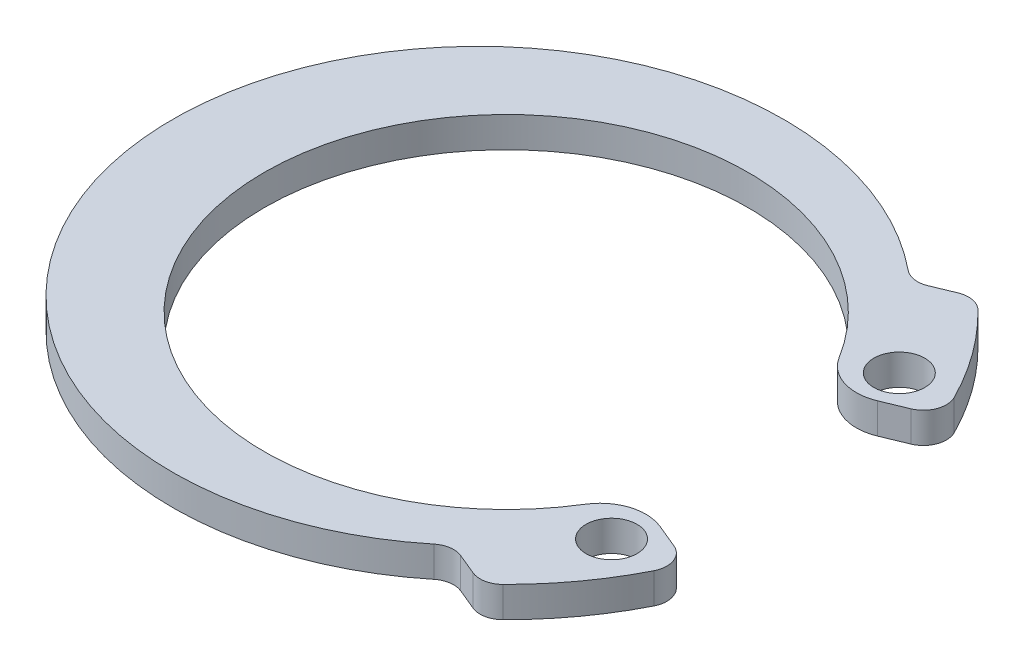
ISO-10303-21;
HEADER;
FILE_DESCRIPTION(('STEP AP214'),'2;1');
FILE_NAME('part.step','',(''),(''),'','','');
FILE_SCHEMA(('AUTOMOTIVE_DESIGN { 1 0 10303 214 1 1 1 1 }'));
ENDSEC;
DATA;
#1=APPLICATION_CONTEXT('core data for automotive mechanical design processes');
#2=APPLICATION_PROTOCOL_DEFINITION('international standard','automotive_design',2000,#1);
#3=PRODUCT_CONTEXT('',#1,'mechanical');
#4=PRODUCT('Part','Part','',(#3));
#5=PRODUCT_RELATED_PRODUCT_CATEGORY('part','',(#4));
#6=PRODUCT_DEFINITION_FORMATION('','',#4);
#7=PRODUCT_DEFINITION_CONTEXT('part definition',#1,'design');
#8=PRODUCT_DEFINITION('design','',#6,#7);
#9=PRODUCT_DEFINITION_SHAPE('','',#8);
#10=(LENGTH_UNIT() NAMED_UNIT(*) SI_UNIT(.MILLI.,.METRE.));
#11=(NAMED_UNIT(*) PLANE_ANGLE_UNIT() SI_UNIT($,.RADIAN.));
#12=(NAMED_UNIT(*) SI_UNIT($,.STERADIAN.) SOLID_ANGLE_UNIT());
#13=UNCERTAINTY_MEASURE_WITH_UNIT(LENGTH_MEASURE(1.E-05),#10,'distance_accuracy_value','');
#14=(GEOMETRIC_REPRESENTATION_CONTEXT(3) GLOBAL_UNCERTAINTY_ASSIGNED_CONTEXT((#13)) GLOBAL_UNIT_ASSIGNED_CONTEXT((#10,
#11,#12)) REPRESENTATION_CONTEXT('',''));
#15=CARTESIAN_POINT('',(0.,0.,0.));
#16=DIRECTION('',(0.,0.,1.));
#17=DIRECTION('',(1.,0.,0.));
#18=AXIS2_PLACEMENT_3D('',#15,#16,#17);
#19=CARTESIAN_POINT('',(4.28209468372585,0.3,4.34438316905942));
#20=DIRECTION('',(0.,1.,0.));
#21=DIRECTION('',(0.,0.,1.));
#22=AXIS2_PLACEMENT_3D('',#19,#20,#21);
#23=PLANE('',#22);
#24=CARTESIAN_POINT('',(4.89304353138207,0.3,2.82500000000001));
#25=DIRECTION('',(0.,1.,0.));
#26=DIRECTION('',(0.,0.,1.));
#27=AXIS2_PLACEMENT_3D('',#24,#25,#26);
#28=CIRCLE('',#27,0.5);
#29=CARTESIAN_POINT('',(4.89304353138207,0.3,3.32500000000001));
#30=VERTEX_POINT('',#29);
#31=EDGE_CURVE('E222',#30,#30,#28,.T.);
#32=ORIENTED_EDGE('',*,*,#31,.F.);
#33=EDGE_LOOP('',(#32));
#34=FACE_BOUND('',#33,.T.);
#35=CARTESIAN_POINT('',(4.28209468372585,0.3,4.34438316905942));
#36=DIRECTION('',(0.,1.,0.));
#37=DIRECTION('',(0.,0.,1.));
#38=AXIS2_PLACEMENT_3D('',#35,#36,#37);
#39=CIRCLE('',#38,0.45);
#40=CARTESIAN_POINT('',(4.10988713916156,0.3,4.7601289586895));
#41=VERTEX_POINT('',#40);
#42=CARTESIAN_POINT('',(4.59798691449251,0.3,4.66487045202282));
#43=VERTEX_POINT('',#42);
#44=EDGE_CURVE('E225',#41,#43,#39,.T.);
#45=ORIENTED_EDGE('',*,*,#44,.T.);
#46=CARTESIAN_POINT('',(0.,0.3,0.));
#47=DIRECTION('',(0.,1.,0.));
#48=DIRECTION('',(0.,0.,1.));
#49=AXIS2_PLACEMENT_3D('',#46,#47,#48);
#50=CIRCLE('',#49,6.55);
#51=CARTESIAN_POINT('',(5.85001094667601,0.3,2.94616223649868));
#52=VERTEX_POINT('',#51);
#53=EDGE_CURVE('E157',#43,#52,#50,.T.);
#54=ORIENTED_EDGE('',*,*,#53,.T.);
#55=CARTESIAN_POINT('',(5.44810179766773,0.3,2.7437541439148));
#56=DIRECTION('',(0.,1.,0.));
#57=DIRECTION('',(0.,0.,-1.));
#58=AXIS2_PLACEMENT_3D('',#55,#56,#57);
#59=CIRCLE('',#58,0.45);
#60=CARTESIAN_POINT('',(5.62030934223202,0.3,2.32800835428472));
#61=VERTEX_POINT('',#60);
#62=EDGE_CURVE('E228',#52,#61,#59,.T.);
#63=ORIENTED_EDGE('',*,*,#62,.T.);
#64=DIRECTION('',(-0.923879532511286,0.,-0.382683432365091));
#65=VECTOR('',#64,1.);
#66=CARTESIAN_POINT('',(5.15326885237256,0.3,2.13455384920756));
#67=LINE('',#66,#65);
#68=CARTESIAN_POINT('',(5.15326885237256,0.3,2.13455384920756));
#69=VERTEX_POINT('',#68);
#70=EDGE_CURVE('E230',#61,#69,#67,.T.);
#71=ORIENTED_EDGE('',*,*,#70,.T.);
#72=CARTESIAN_POINT('',(4.80885376324398,0.3,2.96604542846771));
#73=DIRECTION('',(0.,1.,0.));
#74=DIRECTION('',(0.,0.,1.));
#75=AXIS2_PLACEMENT_3D('',#72,#73,#74);
#76=CIRCLE('',#75,0.9);
#77=CARTESIAN_POINT('',(4.04284165936441,0.3,2.49357801508347));
#78=VERTEX_POINT('',#77);
#79=EDGE_CURVE('E232',#69,#78,#76,.T.);
#80=ORIENTED_EDGE('',*,*,#79,.T.);
#81=CARTESIAN_POINT('',(0.,0.3,0.));
#82=DIRECTION('',(0.,-1.,0.));
#83=DIRECTION('',(0.,0.,1.));
#84=AXIS2_PLACEMENT_3D('',#81,#82,#83);
#85=CIRCLE('',#84,4.75);
#86=CARTESIAN_POINT('',(4.04284165936441,0.3,-2.49357801508348));
#87=VERTEX_POINT('',#86);
#88=EDGE_CURVE('E234',#78,#87,#85,.T.);
#89=ORIENTED_EDGE('',*,*,#88,.T.);
#90=CARTESIAN_POINT('',(4.80885376324398,0.3,-2.96604542846771));
#91=DIRECTION('',(0.,1.,0.));
#92=DIRECTION('',(0.,0.,-1.));
#93=AXIS2_PLACEMENT_3D('',#90,#91,#92);
#94=CIRCLE('',#93,0.899999999999999);
#95=CARTESIAN_POINT('',(5.15326885237256,0.3,-2.13455384920756));
#96=VERTEX_POINT('',#95);
#97=EDGE_CURVE('E236',#87,#96,#94,.T.);
#98=ORIENTED_EDGE('',*,*,#97,.T.);
#99=DIRECTION('',(0.923879532511287,0.,-0.38268343236509));
#100=VECTOR('',#99,1.);
#101=CARTESIAN_POINT('',(5.15326885237256,0.3,-2.13455384920756));
#102=LINE('',#101,#100);
#103=CARTESIAN_POINT('',(5.62030934223202,0.3,-2.32800835428472));
#104=VERTEX_POINT('',#103);
#105=EDGE_CURVE('E238',#96,#104,#102,.T.);
#106=ORIENTED_EDGE('',*,*,#105,.T.);
#107=CARTESIAN_POINT('',(5.44810179766773,0.3,-2.7437541439148));
#108=DIRECTION('',(0.,1.,0.));
#109=DIRECTION('',(0.,0.,1.));
#110=AXIS2_PLACEMENT_3D('',#107,#108,#109);
#111=CIRCLE('',#110,0.45);
#112=CARTESIAN_POINT('',(5.85001094667601,0.3,-2.94616223649868));
#113=VERTEX_POINT('',#112);
#114=EDGE_CURVE('E240',#104,#113,#111,.T.);
#115=ORIENTED_EDGE('',*,*,#114,.T.);
#116=CARTESIAN_POINT('',(0.,0.3,0.));
#117=DIRECTION('',(0.,1.,0.));
#118=DIRECTION('',(0.,0.,-1.));
#119=AXIS2_PLACEMENT_3D('',#116,#117,#118);
#120=CIRCLE('',#119,6.55);
#121=CARTESIAN_POINT('',(4.59798691449251,0.3,-4.66487045202282));
#122=VERTEX_POINT('',#121);
#123=EDGE_CURVE('E242',#113,#122,#120,.T.);
#124=ORIENTED_EDGE('',*,*,#123,.T.);
#125=CARTESIAN_POINT('',(4.28209468372585,0.3,-4.34438316905942));
#126=DIRECTION('',(0.,1.,0.));
#127=DIRECTION('',(0.,0.,-1.));
#128=AXIS2_PLACEMENT_3D('',#125,#126,#127);
#129=CIRCLE('',#128,0.449999999999999);
#130=CARTESIAN_POINT('',(4.10988713916156,0.3,-4.7601289586895));
#131=VERTEX_POINT('',#130);
#132=EDGE_CURVE('E244',#122,#131,#129,.T.);
#133=ORIENTED_EDGE('',*,*,#132,.T.);
#134=DIRECTION('',(-0.923879532511287,0.,0.38268343236509));
#135=VECTOR('',#134,1.);
#136=CARTESIAN_POINT('',(3.69365894425914,0.3,-4.58772159531885));
#137=LINE('',#136,#135);
#138=CARTESIAN_POINT('',(3.69365894425914,0.3,-4.58772159531885));
#139=VERTEX_POINT('',#138);
#140=EDGE_CURVE('E246',#131,#139,#137,.T.);
#141=ORIENTED_EDGE('',*,*,#140,.T.);
#142=CARTESIAN_POINT('',(3.52145139969485,0.3,-5.00346738494892));
#143=DIRECTION('',(0.,-1.,0.));
#144=DIRECTION('',(0.,0.,1.));
#145=AXIS2_PLACEMENT_3D('',#142,#143,#144);
#146=CIRCLE('',#145,0.45);
#147=CARTESIAN_POINT('',(3.23744479467802,0.3,-4.65441115981203));
#148=VERTEX_POINT('',#147);
#149=EDGE_CURVE('E248',#139,#148,#146,.T.);
#150=ORIENTED_EDGE('',*,*,#149,.T.);
#151=CARTESIAN_POINT('',(-0.549576941812182,0.3,0.));
#152=DIRECTION('',(0.,1.,0.));
#153=DIRECTION('',(0.,0.,1.));
#154=AXIS2_PLACEMENT_3D('',#151,#152,#153);
#155=CIRCLE('',#154,6.00042305818782);
#156=CARTESIAN_POINT('',(3.23744479467802,0.3,4.65441115981203));
#157=VERTEX_POINT('',#156);
#158=EDGE_CURVE('E250',#148,#157,#155,.T.);
#159=ORIENTED_EDGE('',*,*,#158,.T.);
#160=CARTESIAN_POINT('',(3.52145139969485,0.3,5.00346738494892));
#161=DIRECTION('',(0.,-1.,0.));
#162=DIRECTION('',(0.,0.,-1.));
#163=AXIS2_PLACEMENT_3D('',#160,#161,#162);
#164=CIRCLE('',#163,0.450000000000001);
#165=CARTESIAN_POINT('',(3.69365894425914,0.3,4.58772159531884));
#166=VERTEX_POINT('',#165);
#167=EDGE_CURVE('E61',#157,#166,#164,.T.);
#168=ORIENTED_EDGE('',*,*,#167,.T.);
#169=DIRECTION('',(0.923879532511286,0.,0.382683432365092));
#170=VECTOR('',#169,1.);
#171=CARTESIAN_POINT('',(3.69365894425914,0.3,4.58772159531884));
#172=LINE('',#171,#170);
#173=EDGE_CURVE('E56',#166,#41,#172,.T.);
#174=ORIENTED_EDGE('',*,*,#173,.T.);
#175=EDGE_LOOP('',(#45,#54,#63,#71,#80,#89,#98,#106,#115,#124,#133,#141,#150,#159,#168,#174));
#176=FACE_BOUND('',#175,.T.);
#177=CARTESIAN_POINT('',(4.89304353138207,0.3,-2.82500000000001));
#178=DIRECTION('',(0.,1.,0.));
#179=DIRECTION('',(0.,0.,1.));
#180=AXIS2_PLACEMENT_3D('',#177,#178,#179);
#181=CIRCLE('',#180,0.5);
#182=CARTESIAN_POINT('',(4.89304353138207,0.3,-2.32500000000001));
#183=VERTEX_POINT('',#182);
#184=EDGE_CURVE('E219',#183,#183,#181,.T.);
#185=ORIENTED_EDGE('',*,*,#184,.F.);
#186=EDGE_LOOP('',(#185));
#187=FACE_BOUND('',#186,.T.);
#188=ADVANCED_FACE('F41',(#34,#176,#187),#23,.T.);
#189=CARTESIAN_POINT('',(4.28209468372585,0.3,4.34438316905942));
#190=DIRECTION('',(0.,-1.,0.));
#191=DIRECTION('',(0.,0.,-1.));
#192=AXIS2_PLACEMENT_3D('',#189,#190,#191);
#193=CYLINDRICAL_SURFACE('',#192,0.45);
#194=DIRECTION('',(0.,-1.,0.));
#195=VECTOR('',#194,1.);
#196=CARTESIAN_POINT('',(4.10988713916156,0.3,4.7601289586895));
#197=LINE('',#196,#195);
#198=CARTESIAN_POINT('',(4.10988713916156,-0.3,4.7601289586895));
#199=VERTEX_POINT('',#198);
#200=EDGE_CURVE('E172',#41,#199,#197,.T.);
#201=ORIENTED_EDGE('',*,*,#200,.T.);
#202=CARTESIAN_POINT('',(4.28209468372585,-0.3,4.34438316905942));
#203=DIRECTION('',(0.,1.,0.));
#204=DIRECTION('',(0.,0.,1.));
#205=AXIS2_PLACEMENT_3D('',#202,#203,#204);
#206=CIRCLE('',#205,0.45);
#207=CARTESIAN_POINT('',(4.59798691449251,-0.3,4.66487045202282));
#208=VERTEX_POINT('',#207);
#209=EDGE_CURVE('E166',#199,#208,#206,.T.);
#210=ORIENTED_EDGE('',*,*,#209,.T.);
#211=DIRECTION('',(0.,-1.,0.));
#212=VECTOR('',#211,1.);
#213=CARTESIAN_POINT('',(4.59798691449251,0.3,4.66487045202282));
#214=LINE('',#213,#212);
#215=EDGE_CURVE('E11',#43,#208,#214,.T.);
#216=ORIENTED_EDGE('',*,*,#215,.F.);
#217=ORIENTED_EDGE('',*,*,#44,.F.);
#218=EDGE_LOOP('',(#201,#210,#216,#217));
#219=FACE_BOUND('',#218,.T.);
#220=ADVANCED_FACE('F43',(#219),#193,.T.);
#221=CARTESIAN_POINT('',(0.,0.3,0.));
#222=DIRECTION('',(0.,-1.,0.));
#223=DIRECTION('',(0.,0.,-1.));
#224=AXIS2_PLACEMENT_3D('',#221,#222,#223);
#225=CYLINDRICAL_SURFACE('',#224,6.55);
#226=ORIENTED_EDGE('',*,*,#215,.T.);
#227=CARTESIAN_POINT('',(0.,-0.3,0.));
#228=DIRECTION('',(0.,1.,0.));
#229=DIRECTION('',(0.,0.,1.));
#230=AXIS2_PLACEMENT_3D('',#227,#228,#229);
#231=CIRCLE('',#230,6.55);
#232=CARTESIAN_POINT('',(5.85001094667601,-0.3,2.94616223649868));
#233=VERTEX_POINT('',#232);
#234=EDGE_CURVE('E156',#208,#233,#231,.T.);
#235=ORIENTED_EDGE('',*,*,#234,.T.);
#236=DIRECTION('',(0.,-1.,0.));
#237=VECTOR('',#236,1.);
#238=CARTESIAN_POINT('',(5.85001094667601,0.3,2.94616223649868));
#239=LINE('',#238,#237);
#240=EDGE_CURVE('E49',#52,#233,#239,.T.);
#241=ORIENTED_EDGE('',*,*,#240,.F.);
#242=ORIENTED_EDGE('',*,*,#53,.F.);
#243=EDGE_LOOP('',(#226,#235,#241,#242));
#244=FACE_BOUND('',#243,.T.);
#245=ADVANCED_FACE('F154',(#244),#225,.T.);
#246=CARTESIAN_POINT('',(5.44810179766773,0.3,2.7437541439148));
#247=DIRECTION('',(0.,-1.,0.));
#248=DIRECTION('',(0.,0.,-1.));
#249=AXIS2_PLACEMENT_3D('',#246,#247,#248);
#250=CYLINDRICAL_SURFACE('',#249,0.45);
#251=ORIENTED_EDGE('',*,*,#240,.T.);
#252=CARTESIAN_POINT('',(5.44810179766773,-0.3,2.7437541439148));
#253=DIRECTION('',(0.,1.,0.));
#254=DIRECTION('',(0.,0.,-1.));
#255=AXIS2_PLACEMENT_3D('',#252,#253,#254);
#256=CIRCLE('',#255,0.45);
#257=CARTESIAN_POINT('',(5.62030934223202,-0.3,2.32800835428472));
#258=VERTEX_POINT('',#257);
#259=EDGE_CURVE('E170',#233,#258,#256,.T.);
#260=ORIENTED_EDGE('',*,*,#259,.T.);
#261=DIRECTION('',(0.,-1.,0.));
#262=VECTOR('',#261,1.);
#263=CARTESIAN_POINT('',(5.62030934223202,0.3,2.32800835428472));
#264=LINE('',#263,#262);
#265=EDGE_CURVE('E279',#61,#258,#264,.T.);
#266=ORIENTED_EDGE('',*,*,#265,.F.);
#267=ORIENTED_EDGE('',*,*,#62,.F.);
#268=EDGE_LOOP('',(#251,#260,#266,#267));
#269=FACE_BOUND('',#268,.T.);
#270=ADVANCED_FACE('F282',(#269),#250,.T.);
#271=CARTESIAN_POINT('',(5.15326885237256,0.3,2.13455384920756));
#272=DIRECTION('',(-0.382683432365091,0.,0.923879532511286));
#273=DIRECTION('',(0.923879532511287,0.,0.382683432365091));
#274=AXIS2_PLACEMENT_3D('',#271,#272,#273);
#275=PLANE('',#274);
#276=ORIENTED_EDGE('',*,*,#265,.T.);
#277=DIRECTION('',(-0.923879532511286,0.,-0.382683432365091));
#278=VECTOR('',#277,1.);
#279=CARTESIAN_POINT('',(5.15326885237256,-0.3,2.13455384920756));
#280=LINE('',#279,#278);
#281=CARTESIAN_POINT('',(5.15326885237256,-0.3,2.13455384920756));
#282=VERTEX_POINT('',#281);
#283=EDGE_CURVE('E181',#258,#282,#280,.T.);
#284=ORIENTED_EDGE('',*,*,#283,.T.);
#285=DIRECTION('',(0.,-1.,0.));
#286=VECTOR('',#285,1.);
#287=CARTESIAN_POINT('',(5.15326885237256,0.3,2.13455384920756));
#288=LINE('',#287,#286);
#289=EDGE_CURVE('E277',#69,#282,#288,.T.);
#290=ORIENTED_EDGE('',*,*,#289,.F.);
#291=ORIENTED_EDGE('',*,*,#70,.F.);
#292=EDGE_LOOP('',(#276,#284,#290,#291));
#293=FACE_BOUND('',#292,.T.);
#294=ADVANCED_FACE('F290',(#293),#275,.F.);
#295=CARTESIAN_POINT('',(4.80885376324398,0.3,2.96604542846771));
#296=DIRECTION('',(0.,-1.,0.));
#297=DIRECTION('',(0.,0.,-1.));
#298=AXIS2_PLACEMENT_3D('',#295,#296,#297);
#299=CYLINDRICAL_SURFACE('',#298,0.9);
#300=ORIENTED_EDGE('',*,*,#289,.T.);
#301=CARTESIAN_POINT('',(4.80885376324398,-0.3,2.96604542846771));
#302=DIRECTION('',(0.,1.,0.));
#303=DIRECTION('',(0.,0.,1.));
#304=AXIS2_PLACEMENT_3D('',#301,#302,#303);
#305=CIRCLE('',#304,0.9);
#306=CARTESIAN_POINT('',(4.04284165936441,-0.3,2.49357801508347));
#307=VERTEX_POINT('',#306);
#308=EDGE_CURVE('E184',#282,#307,#305,.T.);
#309=ORIENTED_EDGE('',*,*,#308,.T.);
#310=DIRECTION('',(0.,-1.,0.));
#311=VECTOR('',#310,1.);
#312=CARTESIAN_POINT('',(4.04284165936441,0.3,2.49357801508347));
#313=LINE('',#312,#311);
#314=EDGE_CURVE('E275',#78,#307,#313,.T.);
#315=ORIENTED_EDGE('',*,*,#314,.F.);
#316=ORIENTED_EDGE('',*,*,#79,.F.);
#317=EDGE_LOOP('',(#300,#309,#315,#316));
#318=FACE_BOUND('',#317,.T.);
#319=ADVANCED_FACE('F293',(#318),#299,.T.);
#320=CARTESIAN_POINT('',(0.,0.3,0.));
#321=DIRECTION('',(0.,-1.,0.));
#322=DIRECTION('',(0.,0.,-1.));
#323=AXIS2_PLACEMENT_3D('',#320,#321,#322);
#324=CYLINDRICAL_SURFACE('',#323,4.75);
#325=ORIENTED_EDGE('',*,*,#314,.T.);
#326=CARTESIAN_POINT('',(0.,-0.3,0.));
#327=DIRECTION('',(0.,-1.,0.));
#328=DIRECTION('',(0.,0.,1.));
#329=AXIS2_PLACEMENT_3D('',#326,#327,#328);
#330=CIRCLE('',#329,4.75);
#331=CARTESIAN_POINT('',(4.04284165936441,-0.3,-2.49357801508348));
#332=VERTEX_POINT('',#331);
#333=EDGE_CURVE('E187',#307,#332,#330,.T.);
#334=ORIENTED_EDGE('',*,*,#333,.T.);
#335=DIRECTION('',(0.,-1.,0.));
#336=VECTOR('',#335,1.);
#337=CARTESIAN_POINT('',(4.04284165936441,0.3,-2.49357801508348));
#338=LINE('',#337,#336);
#339=EDGE_CURVE('E273',#87,#332,#338,.T.);
#340=ORIENTED_EDGE('',*,*,#339,.F.);
#341=ORIENTED_EDGE('',*,*,#88,.F.);
#342=EDGE_LOOP('',(#325,#334,#340,#341));
#343=FACE_BOUND('',#342,.T.);
#344=ADVANCED_FACE('F298',(#343),#324,.F.);
#345=CARTESIAN_POINT('',(4.80885376324398,0.3,-2.96604542846771));
#346=DIRECTION('',(0.,-1.,0.));
#347=DIRECTION('',(0.,0.,-1.));
#348=AXIS2_PLACEMENT_3D('',#345,#346,#347);
#349=CYLINDRICAL_SURFACE('',#348,0.899999999999999);
#350=ORIENTED_EDGE('',*,*,#339,.T.);
#351=CARTESIAN_POINT('',(4.80885376324398,-0.3,-2.96604542846771));
#352=DIRECTION('',(0.,1.,0.));
#353=DIRECTION('',(0.,0.,-1.));
#354=AXIS2_PLACEMENT_3D('',#351,#352,#353);
#355=CIRCLE('',#354,0.899999999999999);
#356=CARTESIAN_POINT('',(5.15326885237256,-0.3,-2.13455384920756));
#357=VERTEX_POINT('',#356);
#358=EDGE_CURVE('E190',#332,#357,#355,.T.);
#359=ORIENTED_EDGE('',*,*,#358,.T.);
#360=DIRECTION('',(0.,-1.,0.));
#361=VECTOR('',#360,1.);
#362=CARTESIAN_POINT('',(5.15326885237256,0.3,-2.13455384920756));
#363=LINE('',#362,#361);
#364=EDGE_CURVE('E271',#96,#357,#363,.T.);
#365=ORIENTED_EDGE('',*,*,#364,.F.);
#366=ORIENTED_EDGE('',*,*,#97,.F.);
#367=EDGE_LOOP('',(#350,#359,#365,#366));
#368=FACE_BOUND('',#367,.T.);
#369=ADVANCED_FACE('F304',(#368),#349,.T.);
#370=CARTESIAN_POINT('',(5.15326885237256,0.3,-2.13455384920756));
#371=DIRECTION('',(-0.38268343236509,0.,-0.923879532511287));
#372=DIRECTION('',(-0.923879532511287,0.,0.38268343236509));
#373=AXIS2_PLACEMENT_3D('',#370,#371,#372);
#374=PLANE('',#373);
#375=ORIENTED_EDGE('',*,*,#364,.T.);
#376=DIRECTION('',(0.923879532511287,0.,-0.38268343236509));
#377=VECTOR('',#376,1.);
#378=CARTESIAN_POINT('',(5.15326885237256,-0.3,-2.13455384920756));
#379=LINE('',#378,#377);
#380=CARTESIAN_POINT('',(5.62030934223202,-0.3,-2.32800835428472));
#381=VERTEX_POINT('',#380);
#382=EDGE_CURVE('E193',#357,#381,#379,.T.);
#383=ORIENTED_EDGE('',*,*,#382,.T.);
#384=DIRECTION('',(0.,-1.,0.));
#385=VECTOR('',#384,1.);
#386=CARTESIAN_POINT('',(5.62030934223202,0.3,-2.32800835428472));
#387=LINE('',#386,#385);
#388=EDGE_CURVE('E269',#104,#381,#387,.T.);
#389=ORIENTED_EDGE('',*,*,#388,.F.);
#390=ORIENTED_EDGE('',*,*,#105,.F.);
#391=EDGE_LOOP('',(#375,#383,#389,#390));
#392=FACE_BOUND('',#391,.T.);
#393=ADVANCED_FACE('F308',(#392),#374,.F.);
#394=CARTESIAN_POINT('',(5.44810179766773,0.3,-2.7437541439148));
#395=DIRECTION('',(0.,-1.,0.));
#396=DIRECTION('',(0.,0.,-1.));
#397=AXIS2_PLACEMENT_3D('',#394,#395,#396);
#398=CYLINDRICAL_SURFACE('',#397,0.45);
#399=ORIENTED_EDGE('',*,*,#388,.T.);
#400=CARTESIAN_POINT('',(5.44810179766773,-0.3,-2.7437541439148));
#401=DIRECTION('',(0.,1.,0.));
#402=DIRECTION('',(0.,0.,1.));
#403=AXIS2_PLACEMENT_3D('',#400,#401,#402);
#404=CIRCLE('',#403,0.45);
#405=CARTESIAN_POINT('',(5.85001094667601,-0.3,-2.94616223649868));
#406=VERTEX_POINT('',#405);
#407=EDGE_CURVE('E196',#381,#406,#404,.T.);
#408=ORIENTED_EDGE('',*,*,#407,.T.);
#409=DIRECTION('',(0.,-1.,0.));
#410=VECTOR('',#409,1.);
#411=CARTESIAN_POINT('',(5.85001094667601,0.3,-2.94616223649868));
#412=LINE('',#411,#410);
#413=EDGE_CURVE('E267',#113,#406,#412,.T.);
#414=ORIENTED_EDGE('',*,*,#413,.F.);
#415=ORIENTED_EDGE('',*,*,#114,.F.);
#416=EDGE_LOOP('',(#399,#408,#414,#415));
#417=FACE_BOUND('',#416,.T.);
#418=ADVANCED_FACE('F313',(#417),#398,.T.);
#419=CARTESIAN_POINT('',(0.,0.3,0.));
#420=DIRECTION('',(0.,-1.,0.));
#421=DIRECTION('',(0.,0.,-1.));
#422=AXIS2_PLACEMENT_3D('',#419,#420,#421);
#423=CYLINDRICAL_SURFACE('',#422,6.55);
#424=ORIENTED_EDGE('',*,*,#413,.T.);
#425=CARTESIAN_POINT('',(0.,-0.3,0.));
#426=DIRECTION('',(0.,1.,0.));
#427=DIRECTION('',(0.,0.,-1.));
#428=AXIS2_PLACEMENT_3D('',#425,#426,#427);
#429=CIRCLE('',#428,6.55);
#430=CARTESIAN_POINT('',(4.59798691449251,-0.3,-4.66487045202282));
#431=VERTEX_POINT('',#430);
#432=EDGE_CURVE('E199',#406,#431,#429,.T.);
#433=ORIENTED_EDGE('',*,*,#432,.T.);
#434=DIRECTION('',(0.,-1.,0.));
#435=VECTOR('',#434,1.);
#436=CARTESIAN_POINT('',(4.59798691449251,0.3,-4.66487045202282));
#437=LINE('',#436,#435);
#438=EDGE_CURVE('E265',#122,#431,#437,.T.);
#439=ORIENTED_EDGE('',*,*,#438,.F.);
#440=ORIENTED_EDGE('',*,*,#123,.F.);
#441=EDGE_LOOP('',(#424,#433,#439,#440));
#442=FACE_BOUND('',#441,.T.);
#443=ADVANCED_FACE('F319',(#442),#423,.T.);
#444=CARTESIAN_POINT('',(4.28209468372585,0.3,-4.34438316905942));
#445=DIRECTION('',(0.,-1.,0.));
#446=DIRECTION('',(0.,0.,-1.));
#447=AXIS2_PLACEMENT_3D('',#444,#445,#446);
#448=CYLINDRICAL_SURFACE('',#447,0.449999999999999);
#449=ORIENTED_EDGE('',*,*,#438,.T.);
#450=CARTESIAN_POINT('',(4.28209468372585,-0.3,-4.34438316905942));
#451=DIRECTION('',(0.,1.,0.));
#452=DIRECTION('',(0.,0.,-1.));
#453=AXIS2_PLACEMENT_3D('',#450,#451,#452);
#454=CIRCLE('',#453,0.449999999999999);
#455=CARTESIAN_POINT('',(4.10988713916156,-0.3,-4.7601289586895));
#456=VERTEX_POINT('',#455);
#457=EDGE_CURVE('E202',#431,#456,#454,.T.);
#458=ORIENTED_EDGE('',*,*,#457,.T.);
#459=DIRECTION('',(0.,-1.,0.));
#460=VECTOR('',#459,1.);
#461=CARTESIAN_POINT('',(4.10988713916156,0.3,-4.7601289586895));
#462=LINE('',#461,#460);
#463=EDGE_CURVE('E263',#131,#456,#462,.T.);
#464=ORIENTED_EDGE('',*,*,#463,.F.);
#465=ORIENTED_EDGE('',*,*,#132,.F.);
#466=EDGE_LOOP('',(#449,#458,#464,#465));
#467=FACE_BOUND('',#466,.T.);
#468=ADVANCED_FACE('F323',(#467),#448,.T.);
#469=CARTESIAN_POINT('',(3.69365894425914,0.3,-4.58772159531885));
#470=DIRECTION('',(0.38268343236509,0.,0.923879532511287));
#471=DIRECTION('',(0.923879532511287,0.,-0.38268343236509));
#472=AXIS2_PLACEMENT_3D('',#469,#470,#471);
#473=PLANE('',#472);
#474=ORIENTED_EDGE('',*,*,#463,.T.);
#475=DIRECTION('',(-0.923879532511287,0.,0.38268343236509));
#476=VECTOR('',#475,1.);
#477=CARTESIAN_POINT('',(3.69365894425914,-0.3,-4.58772159531885));
#478=LINE('',#477,#476);
#479=CARTESIAN_POINT('',(3.69365894425914,-0.3,-4.58772159531885));
#480=VERTEX_POINT('',#479);
#481=EDGE_CURVE('E205',#456,#480,#478,.T.);
#482=ORIENTED_EDGE('',*,*,#481,.T.);
#483=DIRECTION('',(0.,-1.,0.));
#484=VECTOR('',#483,1.);
#485=CARTESIAN_POINT('',(3.69365894425914,0.3,-4.58772159531885));
#486=LINE('',#485,#484);
#487=EDGE_CURVE('E261',#139,#480,#486,.T.);
#488=ORIENTED_EDGE('',*,*,#487,.F.);
#489=ORIENTED_EDGE('',*,*,#140,.F.);
#490=EDGE_LOOP('',(#474,#482,#488,#489));
#491=FACE_BOUND('',#490,.T.);
#492=ADVANCED_FACE('F328',(#491),#473,.F.);
#493=CARTESIAN_POINT('',(3.52145139969485,0.3,-5.00346738494892));
#494=DIRECTION('',(0.,-1.,0.));
#495=DIRECTION('',(0.,0.,-1.));
#496=AXIS2_PLACEMENT_3D('',#493,#494,#495);
#497=CYLINDRICAL_SURFACE('',#496,0.45);
#498=ORIENTED_EDGE('',*,*,#487,.T.);
#499=CARTESIAN_POINT('',(3.52145139969485,-0.3,-5.00346738494892));
#500=DIRECTION('',(0.,-1.,0.));
#501=DIRECTION('',(0.,0.,1.));
#502=AXIS2_PLACEMENT_3D('',#499,#500,#501);
#503=CIRCLE('',#502,0.45);
#504=CARTESIAN_POINT('',(3.23744479467802,-0.3,-4.65441115981203));
#505=VERTEX_POINT('',#504);
#506=EDGE_CURVE('E208',#480,#505,#503,.T.);
#507=ORIENTED_EDGE('',*,*,#506,.T.);
#508=DIRECTION('',(0.,-1.,0.));
#509=VECTOR('',#508,1.);
#510=CARTESIAN_POINT('',(3.23744479467802,0.3,-4.65441115981203));
#511=LINE('',#510,#509);
#512=EDGE_CURVE('E259',#148,#505,#511,.T.);
#513=ORIENTED_EDGE('',*,*,#512,.F.);
#514=ORIENTED_EDGE('',*,*,#149,.F.);
#515=EDGE_LOOP('',(#498,#507,#513,#514));
#516=FACE_BOUND('',#515,.T.);
#517=ADVANCED_FACE('F334',(#516),#497,.F.);
#518=CARTESIAN_POINT('',(-0.549576941812182,0.3,0.));
#519=DIRECTION('',(0.,-1.,0.));
#520=DIRECTION('',(0.,0.,-1.));
#521=AXIS2_PLACEMENT_3D('',#518,#519,#520);
#522=CYLINDRICAL_SURFACE('',#521,6.00042305818782);
#523=ORIENTED_EDGE('',*,*,#512,.T.);
#524=CARTESIAN_POINT('',(-0.549576941812182,-0.3,0.));
#525=DIRECTION('',(0.,1.,0.));
#526=DIRECTION('',(0.,0.,1.));
#527=AXIS2_PLACEMENT_3D('',#524,#525,#526);
#528=CIRCLE('',#527,6.00042305818782);
#529=CARTESIAN_POINT('',(3.23744479467802,-0.3,4.65441115981203));
#530=VERTEX_POINT('',#529);
#531=EDGE_CURVE('E211',#505,#530,#528,.T.);
#532=ORIENTED_EDGE('',*,*,#531,.T.);
#533=DIRECTION('',(0.,-1.,0.));
#534=VECTOR('',#533,1.);
#535=CARTESIAN_POINT('',(3.23744479467802,0.3,4.65441115981203));
#536=LINE('',#535,#534);
#537=EDGE_CURVE('E257',#157,#530,#536,.T.);
#538=ORIENTED_EDGE('',*,*,#537,.F.);
#539=ORIENTED_EDGE('',*,*,#158,.F.);
#540=EDGE_LOOP('',(#523,#532,#538,#539));
#541=FACE_BOUND('',#540,.T.);
#542=ADVANCED_FACE('F338',(#541),#522,.T.);
#543=CARTESIAN_POINT('',(3.52145139969485,0.3,5.00346738494892));
#544=DIRECTION('',(0.,-1.,0.));
#545=DIRECTION('',(0.,0.,-1.));
#546=AXIS2_PLACEMENT_3D('',#543,#544,#545);
#547=CYLINDRICAL_SURFACE('',#546,0.450000000000001);
#548=ORIENTED_EDGE('',*,*,#537,.T.);
#549=CARTESIAN_POINT('',(3.52145139969485,-0.3,5.00346738494892));
#550=DIRECTION('',(0.,-1.,0.));
#551=DIRECTION('',(0.,0.,-1.));
#552=AXIS2_PLACEMENT_3D('',#549,#550,#551);
#553=CIRCLE('',#552,0.450000000000001);
#554=CARTESIAN_POINT('',(3.69365894425914,-0.3,4.58772159531884));
#555=VERTEX_POINT('',#554);
#556=EDGE_CURVE('E214',#530,#555,#553,.T.);
#557=ORIENTED_EDGE('',*,*,#556,.T.);
#558=DIRECTION('',(0.,-1.,0.));
#559=VECTOR('',#558,1.);
#560=CARTESIAN_POINT('',(3.69365894425914,0.3,4.58772159531884));
#561=LINE('',#560,#559);
#562=EDGE_CURVE('E255',#166,#555,#561,.T.);
#563=ORIENTED_EDGE('',*,*,#562,.F.);
#564=ORIENTED_EDGE('',*,*,#167,.F.);
#565=EDGE_LOOP('',(#548,#557,#563,#564));
#566=FACE_BOUND('',#565,.T.);
#567=ADVANCED_FACE('F341',(#566),#547,.F.);
#568=CARTESIAN_POINT('',(3.69365894425914,0.3,4.58772159531884));
#569=DIRECTION('',(0.382683432365092,0.,-0.923879532511286));
#570=DIRECTION('',(-0.923879532511286,0.,-0.382683432365092));
#571=AXIS2_PLACEMENT_3D('',#568,#569,#570);
#572=PLANE('',#571);
#573=ORIENTED_EDGE('',*,*,#562,.T.);
#574=DIRECTION('',(0.923879532511286,0.,0.382683432365092));
#575=VECTOR('',#574,1.);
#576=CARTESIAN_POINT('',(3.69365894425914,-0.3,4.58772159531884));
#577=LINE('',#576,#575);
#578=EDGE_CURVE('E217',#555,#199,#577,.T.);
#579=ORIENTED_EDGE('',*,*,#578,.T.);
#580=ORIENTED_EDGE('',*,*,#200,.F.);
#581=ORIENTED_EDGE('',*,*,#173,.F.);
#582=EDGE_LOOP('',(#573,#579,#580,#581));
#583=FACE_BOUND('',#582,.T.);
#584=ADVANCED_FACE('F343',(#583),#572,.F.);
#585=CARTESIAN_POINT('',(4.89304353138207,0.3,2.82500000000001));
#586=DIRECTION('',(0.,-1.,0.));
#587=DIRECTION('',(0.,0.,-1.));
#588=AXIS2_PLACEMENT_3D('',#585,#586,#587);
#589=CYLINDRICAL_SURFACE('',#588,0.5);
#590=ORIENTED_EDGE('',*,*,#31,.T.);
#591=EDGE_LOOP('',(#590));
#592=FACE_BOUND('',#591,.T.);
#593=CARTESIAN_POINT('',(4.89304353138207,-0.3,2.82500000000001));
#594=DIRECTION('',(0.,1.,0.));
#595=DIRECTION('',(0.,0.,1.));
#596=AXIS2_PLACEMENT_3D('',#593,#594,#595);
#597=CIRCLE('',#596,0.5);
#598=CARTESIAN_POINT('',(4.89304353138207,-0.3,3.32500000000001));
#599=VERTEX_POINT('',#598);
#600=EDGE_CURVE('E173',#599,#599,#597,.T.);
#601=ORIENTED_EDGE('',*,*,#600,.F.);
#602=EDGE_LOOP('',(#601));
#603=FACE_BOUND('',#602,.T.);
#604=ADVANCED_FACE('F345',(#592,#603),#589,.F.);
#605=CARTESIAN_POINT('',(4.89304353138207,0.3,-2.82500000000001));
#606=DIRECTION('',(0.,-1.,0.));
#607=DIRECTION('',(0.,0.,-1.));
#608=AXIS2_PLACEMENT_3D('',#605,#606,#607);
#609=CYLINDRICAL_SURFACE('',#608,0.5);
#610=ORIENTED_EDGE('',*,*,#184,.T.);
#611=EDGE_LOOP('',(#610));
#612=FACE_BOUND('',#611,.T.);
#613=CARTESIAN_POINT('',(4.89304353138207,-0.3,-2.82500000000001));
#614=DIRECTION('',(0.,1.,0.));
#615=DIRECTION('',(0.,0.,1.));
#616=AXIS2_PLACEMENT_3D('',#613,#614,#615);
#617=CIRCLE('',#616,0.5);
#618=CARTESIAN_POINT('',(4.89304353138207,-0.3,-2.32500000000001));
#619=VERTEX_POINT('',#618);
#620=EDGE_CURVE('E176',#619,#619,#617,.T.);
#621=ORIENTED_EDGE('',*,*,#620,.F.);
#622=EDGE_LOOP('',(#621));
#623=FACE_BOUND('',#622,.T.);
#624=ADVANCED_FACE('F351',(#612,#623),#609,.F.);
#625=CARTESIAN_POINT('',(4.28209468372585,-0.3,4.34438316905942));
#626=DIRECTION('',(0.,1.,0.));
#627=DIRECTION('',(0.,0.,1.));
#628=AXIS2_PLACEMENT_3D('',#625,#626,#627);
#629=PLANE('',#628);
#630=ORIENTED_EDGE('',*,*,#620,.T.);
#631=EDGE_LOOP('',(#630));
#632=FACE_BOUND('',#631,.T.);
#633=ORIENTED_EDGE('',*,*,#600,.T.);
#634=EDGE_LOOP('',(#633));
#635=FACE_BOUND('',#634,.T.);
#636=ORIENTED_EDGE('',*,*,#209,.F.);
#637=ORIENTED_EDGE('',*,*,#578,.F.);
#638=ORIENTED_EDGE('',*,*,#556,.F.);
#639=ORIENTED_EDGE('',*,*,#531,.F.);
#640=ORIENTED_EDGE('',*,*,#506,.F.);
#641=ORIENTED_EDGE('',*,*,#481,.F.);
#642=ORIENTED_EDGE('',*,*,#457,.F.);
#643=ORIENTED_EDGE('',*,*,#432,.F.);
#644=ORIENTED_EDGE('',*,*,#407,.F.);
#645=ORIENTED_EDGE('',*,*,#382,.F.);
#646=ORIENTED_EDGE('',*,*,#358,.F.);
#647=ORIENTED_EDGE('',*,*,#333,.F.);
#648=ORIENTED_EDGE('',*,*,#308,.F.);
#649=ORIENTED_EDGE('',*,*,#283,.F.);
#650=ORIENTED_EDGE('',*,*,#259,.F.);
#651=ORIENTED_EDGE('',*,*,#234,.F.);
#652=EDGE_LOOP('',(#636,#637,#638,#639,#640,#641,#642,#643,#644,#645,#646,#647,#648,#649,#650,#651));
#653=FACE_BOUND('',#652,.T.);
#654=ADVANCED_FACE('F164',(#632,#635,#653),#629,.F.);
#655=CLOSED_SHELL('',(#188,#220,#245,#270,#294,#319,#344,#369,#393,#418,#443,#468,#492,#517,
#542,#567,#584,#604,#624,#654));
#656=MANIFOLD_SOLID_BREP('B2',#655);
#657=ADVANCED_BREP_SHAPE_REPRESENTATION('',(#18,#656),#14);
#658=SHAPE_DEFINITION_REPRESENTATION(#9,#657);
ENDSEC;
END-ISO-10303-21;
